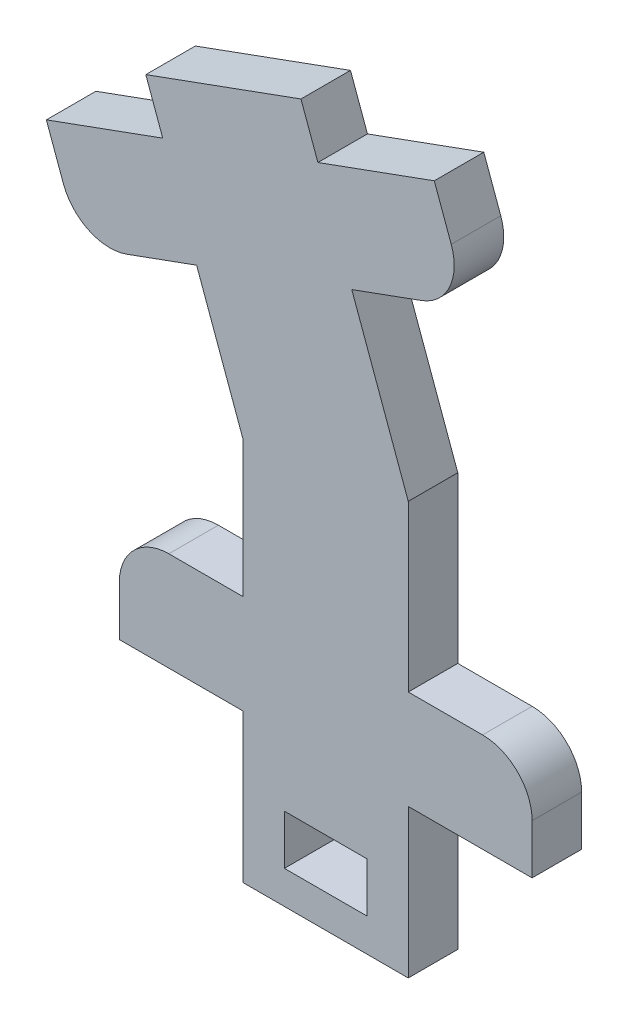
ISO-10303-21;
HEADER;
FILE_DESCRIPTION(('STEP AP214'),'2;1');
FILE_NAME('part.step','',(''),(''),'','','');
FILE_SCHEMA(('AUTOMOTIVE_DESIGN { 1 0 10303 214 1 1 1 1 }'));
ENDSEC;
DATA;
#1=APPLICATION_CONTEXT('core data for automotive mechanical design processes');
#2=APPLICATION_PROTOCOL_DEFINITION('international standard','automotive_design',2000,#1);
#3=PRODUCT_CONTEXT('',#1,'mechanical');
#4=PRODUCT('Part','Part','',(#3));
#5=PRODUCT_RELATED_PRODUCT_CATEGORY('part','',(#4));
#6=PRODUCT_DEFINITION_FORMATION('','',#4);
#7=PRODUCT_DEFINITION_CONTEXT('part definition',#1,'design');
#8=PRODUCT_DEFINITION('design','',#6,#7);
#9=PRODUCT_DEFINITION_SHAPE('','',#8);
#10=(LENGTH_UNIT() NAMED_UNIT(*) SI_UNIT(.MILLI.,.METRE.));
#11=(NAMED_UNIT(*) PLANE_ANGLE_UNIT() SI_UNIT($,.RADIAN.));
#12=(NAMED_UNIT(*) SI_UNIT($,.STERADIAN.) SOLID_ANGLE_UNIT());
#13=UNCERTAINTY_MEASURE_WITH_UNIT(LENGTH_MEASURE(1.E-05),#10,'distance_accuracy_value','');
#14=(GEOMETRIC_REPRESENTATION_CONTEXT(3) GLOBAL_UNCERTAINTY_ASSIGNED_CONTEXT((#13)) GLOBAL_UNIT_ASSIGNED_CONTEXT((#10,
#11,#12)) REPRESENTATION_CONTEXT('',''));
#15=CARTESIAN_POINT('',(0.,0.,0.));
#16=DIRECTION('',(0.,0.,1.));
#17=DIRECTION('',(1.,0.,0.));
#18=AXIS2_PLACEMENT_3D('',#15,#16,#17);
#19=CARTESIAN_POINT('',(14.5,-11.2367301929153,3.));
#20=DIRECTION('',(0.,0.,1.));
#21=DIRECTION('',(1.,0.,0.));
#22=AXIS2_PLACEMENT_3D('',#19,#20,#21);
#23=PLANE('',#22);
#24=DIRECTION('',(1.,0.,0.));
#25=VECTOR('',#24,1.);
#26=CARTESIAN_POINT('',(-7.49999999999999,-14.2367301929154,3.));
#27=LINE('',#26,#25);
#28=CARTESIAN_POINT('',(-7.49999999999999,-14.2367301929154,3.));
#29=VERTEX_POINT('',#28);
#30=CARTESIAN_POINT('',(0.,-14.2367301929154,3.));
#31=VERTEX_POINT('',#30);
#32=EDGE_CURVE('E285',#29,#31,#27,.T.);
#33=ORIENTED_EDGE('',*,*,#32,.T.);
#34=DIRECTION('',(0.,-1.,0.));
#35=VECTOR('',#34,1.);
#36=CARTESIAN_POINT('',(0.,-14.2367301929154,3.));
#37=LINE('',#36,#35);
#38=CARTESIAN_POINT('',(0.,-23.2367301929154,3.));
#39=VERTEX_POINT('',#38);
#40=EDGE_CURVE('E289',#31,#39,#37,.T.);
#41=ORIENTED_EDGE('',*,*,#40,.T.);
#42=DIRECTION('',(1.,0.,0.));
#43=VECTOR('',#42,1.);
#44=CARTESIAN_POINT('',(0.,-23.2367301929154,3.));
#45=LINE('',#44,#43);
#46=CARTESIAN_POINT('',(10.,-23.2367301929154,3.));
#47=VERTEX_POINT('',#46);
#48=EDGE_CURVE('E293',#39,#47,#45,.T.);
#49=ORIENTED_EDGE('',*,*,#48,.T.);
#50=DIRECTION('',(0.,1.,0.));
#51=VECTOR('',#50,1.);
#52=CARTESIAN_POINT('',(10.,-23.2367301929154,3.));
#53=LINE('',#52,#51);
#54=CARTESIAN_POINT('',(9.99999999999998,-14.2367301929154,3.));
#55=VERTEX_POINT('',#54);
#56=EDGE_CURVE('E296',#47,#55,#53,.T.);
#57=ORIENTED_EDGE('',*,*,#56,.T.);
#58=DIRECTION('',(1.,0.,0.));
#59=VECTOR('',#58,1.);
#60=CARTESIAN_POINT('',(9.99999999999998,-14.2367301929154,3.));
#61=LINE('',#60,#59);
#62=CARTESIAN_POINT('',(17.5,-14.2367301929154,3.));
#63=VERTEX_POINT('',#62);
#64=EDGE_CURVE('E299',#55,#63,#61,.T.);
#65=ORIENTED_EDGE('',*,*,#64,.T.);
#66=DIRECTION('',(0.,1.,0.));
#67=VECTOR('',#66,1.);
#68=CARTESIAN_POINT('',(17.5,-11.2367301929153,3.));
#69=LINE('',#68,#67);
#70=CARTESIAN_POINT('',(17.5,-11.2367301929153,3.));
#71=VERTEX_POINT('',#70);
#72=EDGE_CURVE('E302',#63,#71,#69,.T.);
#73=ORIENTED_EDGE('',*,*,#72,.T.);
#74=CARTESIAN_POINT('',(14.5,-11.2367301929153,3.));
#75=DIRECTION('',(0.,0.,1.));
#76=DIRECTION('',(1.,0.,0.));
#77=AXIS2_PLACEMENT_3D('',#74,#75,#76);
#78=CIRCLE('',#77,3.);
#79=CARTESIAN_POINT('',(14.5,-8.23673019291535,3.));
#80=VERTEX_POINT('',#79);
#81=EDGE_CURVE('E305',#71,#80,#78,.T.);
#82=ORIENTED_EDGE('',*,*,#81,.T.);
#83=DIRECTION('',(-1.,0.,0.));
#84=VECTOR('',#83,1.);
#85=CARTESIAN_POINT('',(10.,-8.23673019291535,3.));
#86=LINE('',#85,#84);
#87=CARTESIAN_POINT('',(10.,-8.23673019291535,3.));
#88=VERTEX_POINT('',#87);
#89=EDGE_CURVE('E308',#80,#88,#86,.T.);
#90=ORIENTED_EDGE('',*,*,#89,.T.);
#91=DIRECTION('',(0.,1.,0.));
#92=VECTOR('',#91,1.);
#93=CARTESIAN_POINT('',(10.,1.76326980708465,3.));
#94=LINE('',#93,#92);
#95=CARTESIAN_POINT('',(10.,1.76326980708465,3.));
#96=VERTEX_POINT('',#95);
#97=EDGE_CURVE('E311',#88,#96,#94,.T.);
#98=ORIENTED_EDGE('',*,*,#97,.T.);
#99=DIRECTION('',(-0.34202014332567,0.939692620785908,0.));
#100=VECTOR('',#99,1.);
#101=CARTESIAN_POINT('',(10.,1.76326980708465,3.));
#102=LINE('',#101,#100);
#103=CARTESIAN_POINT('',(6.5797985667433,11.1601960149437,3.));
#104=VERTEX_POINT('',#103);
#105=EDGE_CURVE('E314',#96,#104,#102,.T.);
#106=ORIENTED_EDGE('',*,*,#105,.T.);
#107=DIRECTION('',(0.939692620785908,0.342020143325671,0.));
#108=VECTOR('',#107,1.);
#109=CARTESIAN_POINT('',(6.5797985667433,11.1601960149437,3.));
#110=LINE('',#109,#108);
#111=CARTESIAN_POINT('',(10.8084153602799,12.6992866599092,3.));
#112=VERTEX_POINT('',#111);
#113=EDGE_CURVE('E317',#104,#112,#110,.T.);
#114=ORIENTED_EDGE('',*,*,#113,.T.);
#115=CARTESIAN_POINT('',(9.78235493030287,15.518364522267,3.));
#116=DIRECTION('',(0.,0.,1.));
#117=DIRECTION('',(-1.,0.,0.));
#118=AXIS2_PLACEMENT_3D('',#115,#116,#117);
#119=CIRCLE('',#118,3.);
#120=CARTESIAN_POINT('',(12.6014327926606,16.544424952244,3.));
#121=VERTEX_POINT('',#120);
#122=EDGE_CURVE('E320',#112,#121,#119,.T.);
#123=ORIENTED_EDGE('',*,*,#122,.T.);
#124=DIRECTION('',(-0.342020143325671,0.939692620785908,0.));
#125=VECTOR('',#124,1.);
#126=CARTESIAN_POINT('',(12.6014327926606,16.544424952244,3.));
#127=LINE('',#126,#125);
#128=CARTESIAN_POINT('',(11.5753723626836,19.3635028146017,3.));
#129=VERTEX_POINT('',#128);
#130=EDGE_CURVE('E323',#121,#129,#127,.T.);
#131=ORIENTED_EDGE('',*,*,#130,.T.);
#132=DIRECTION('',(-0.939692620785907,-0.342020143325672,0.));
#133=VECTOR('',#132,1.);
#134=CARTESIAN_POINT('',(11.5753723626836,19.3635028146017,3.));
#135=LINE('',#134,#133);
#136=CARTESIAN_POINT('',(4.52767770678928,16.7983517396592,3.));
#137=VERTEX_POINT('',#136);
#138=EDGE_CURVE('E326',#129,#137,#135,.T.);
#139=ORIENTED_EDGE('',*,*,#138,.T.);
#140=DIRECTION('',(-0.342020143325671,0.939692620785908,0.));
#141=VECTOR('',#140,1.);
#142=CARTESIAN_POINT('',(4.52767770678928,16.7983517396592,3.));
#143=LINE('',#142,#141);
#144=CARTESIAN_POINT('',(3.50161727681226,19.6174296020169,3.));
#145=VERTEX_POINT('',#144);
#146=EDGE_CURVE('E329',#137,#145,#143,.T.);
#147=ORIENTED_EDGE('',*,*,#146,.T.);
#148=DIRECTION('',(-0.939692620785908,-0.342020143325671,0.));
#149=VECTOR('',#148,1.);
#150=CARTESIAN_POINT('',(3.50161727681226,19.6174296020169,3.));
#151=LINE('',#150,#149);
#152=CARTESIAN_POINT('',(-5.89530893104681,16.1972281687602,3.));
#153=VERTEX_POINT('',#152);
#154=EDGE_CURVE('E332',#145,#153,#151,.T.);
#155=ORIENTED_EDGE('',*,*,#154,.T.);
#156=DIRECTION('',(0.342020143325671,-0.939692620785908,0.));
#157=VECTOR('',#156,1.);
#158=CARTESIAN_POINT('',(-5.89530893104681,16.1972281687602,3.));
#159=LINE('',#158,#157);
#160=CARTESIAN_POINT('',(-4.8692485010698,13.3781503064025,3.));
#161=VERTEX_POINT('',#160);
#162=EDGE_CURVE('E335',#153,#161,#159,.T.);
#163=ORIENTED_EDGE('',*,*,#162,.T.);
#164=DIRECTION('',(-0.939692620785908,-0.34202014332567,0.));
#165=VECTOR('',#164,1.);
#166=CARTESIAN_POINT('',(-4.8692485010698,13.3781503064025,3.));
#167=LINE('',#166,#165);
#168=CARTESIAN_POINT('',(-11.9169431569641,10.8129992314599,3.));
#169=VERTEX_POINT('',#168);
#170=EDGE_CURVE('E338',#161,#169,#167,.T.);
#171=ORIENTED_EDGE('',*,*,#170,.T.);
#172=DIRECTION('',(0.342020143325671,-0.939692620785908,0.));
#173=VECTOR('',#172,1.);
#174=CARTESIAN_POINT('',(-11.9169431569641,10.8129992314599,3.));
#175=LINE('',#174,#173);
#176=CARTESIAN_POINT('',(-10.8908827269871,7.99392136910221,3.));
#177=VERTEX_POINT('',#176);
#178=EDGE_CURVE('E341',#169,#177,#175,.T.);
#179=ORIENTED_EDGE('',*,*,#178,.T.);
#180=CARTESIAN_POINT('',(-8.07180486462937,9.01998179907923,3.));
#181=DIRECTION('',(0.,0.,1.));
#182=DIRECTION('',(1.,0.,0.));
#183=AXIS2_PLACEMENT_3D('',#180,#181,#182);
#184=CIRCLE('',#183,3.);
#185=CARTESIAN_POINT('',(-7.04574443465234,6.20090393672151,3.));
#186=VERTEX_POINT('',#185);
#187=EDGE_CURVE('E344',#177,#186,#184,.T.);
#188=ORIENTED_EDGE('',*,*,#187,.T.);
#189=DIRECTION('',(0.939692620785908,0.342020143325671,0.));
#190=VECTOR('',#189,1.);
#191=CARTESIAN_POINT('',(-7.04574443465234,6.20090393672151,3.));
#192=LINE('',#191,#190);
#193=CARTESIAN_POINT('',(-2.81712764111578,7.73999458168703,3.));
#194=VERTEX_POINT('',#193);
#195=EDGE_CURVE('E347',#186,#194,#192,.T.);
#196=ORIENTED_EDGE('',*,*,#195,.T.);
#197=DIRECTION('',(0.34202014332567,-0.939692620785908,0.));
#198=VECTOR('',#197,1.);
#199=CARTESIAN_POINT('',(-2.81712764111578,7.73999458168703,3.));
#200=LINE('',#199,#198);
#201=CARTESIAN_POINT('',(0.,0.,3.));
#202=VERTEX_POINT('',#201);
#203=EDGE_CURVE('E350',#194,#202,#200,.T.);
#204=ORIENTED_EDGE('',*,*,#203,.T.);
#205=DIRECTION('',(0.,-1.,0.));
#206=VECTOR('',#205,1.);
#207=CARTESIAN_POINT('',(0.,0.,3.));
#208=LINE('',#207,#206);
#209=CARTESIAN_POINT('',(0.,-8.23673019291535,3.));
#210=VERTEX_POINT('',#209);
#211=EDGE_CURVE('E353',#202,#210,#208,.T.);
#212=ORIENTED_EDGE('',*,*,#211,.T.);
#213=DIRECTION('',(-1.,0.,0.));
#214=VECTOR('',#213,1.);
#215=CARTESIAN_POINT('',(0.,-8.23673019291535,3.));
#216=LINE('',#215,#214);
#217=CARTESIAN_POINT('',(-4.49999999999999,-8.23673019291535,3.));
#218=VERTEX_POINT('',#217);
#219=EDGE_CURVE('E356',#210,#218,#216,.T.);
#220=ORIENTED_EDGE('',*,*,#219,.T.);
#221=CARTESIAN_POINT('',(-4.49999999999999,-11.2367301929153,3.));
#222=DIRECTION('',(0.,0.,1.));
#223=DIRECTION('',(-1.,0.,0.));
#224=AXIS2_PLACEMENT_3D('',#221,#222,#223);
#225=CIRCLE('',#224,3.);
#226=CARTESIAN_POINT('',(-7.49999999999999,-11.2367301929153,3.));
#227=VERTEX_POINT('',#226);
#228=EDGE_CURVE('E359',#218,#227,#225,.T.);
#229=ORIENTED_EDGE('',*,*,#228,.T.);
#230=DIRECTION('',(0.,-1.,0.));
#231=VECTOR('',#230,1.);
#232=CARTESIAN_POINT('',(-7.49999999999999,-11.2367301929153,3.));
#233=LINE('',#232,#231);
#234=EDGE_CURVE('E362',#227,#29,#233,.T.);
#235=ORIENTED_EDGE('',*,*,#234,.T.);
#236=EDGE_LOOP('',(#33,#41,#49,#57,#65,#73,#82,#90,#98,#106,#114,#123,#131,#139,#147,#155,#163,
#171,#179,#188,#196,#204,#212,#220,#229,#235));
#237=FACE_BOUND('',#236,.T.);
#238=DIRECTION('',(-1.,0.,0.));
#239=VECTOR('',#238,1.);
#240=CARTESIAN_POINT('',(2.5,-18.2367301929154,3.));
#241=LINE('',#240,#239);
#242=CARTESIAN_POINT('',(7.5,-18.2367301929154,3.));
#243=VERTEX_POINT('',#242);
#244=CARTESIAN_POINT('',(2.5,-18.2367301929154,3.));
#245=VERTEX_POINT('',#244);
#246=EDGE_CURVE('E246',#243,#245,#241,.T.);
#247=ORIENTED_EDGE('',*,*,#246,.F.);
#248=DIRECTION('',(0.,1.,0.));
#249=VECTOR('',#248,1.);
#250=CARTESIAN_POINT('',(7.5,-18.2367301929154,3.));
#251=LINE('',#250,#249);
#252=CARTESIAN_POINT('',(7.5,-21.2367301929154,3.));
#253=VERTEX_POINT('',#252);
#254=EDGE_CURVE('E237',#253,#243,#251,.T.);
#255=ORIENTED_EDGE('',*,*,#254,.F.);
#256=DIRECTION('',(1.,0.,0.));
#257=VECTOR('',#256,1.);
#258=CARTESIAN_POINT('',(2.5,-21.2367301929154,3.));
#259=LINE('',#258,#257);
#260=CARTESIAN_POINT('',(2.5,-21.2367301929154,3.));
#261=VERTEX_POINT('',#260);
#262=EDGE_CURVE('E263',#261,#253,#259,.T.);
#263=ORIENTED_EDGE('',*,*,#262,.F.);
#264=DIRECTION('',(0.,-1.,0.));
#265=VECTOR('',#264,1.);
#266=CARTESIAN_POINT('',(2.5,-18.2367301929154,3.));
#267=LINE('',#266,#265);
#268=EDGE_CURVE('E259',#245,#261,#267,.T.);
#269=ORIENTED_EDGE('',*,*,#268,.F.);
#270=EDGE_LOOP('',(#247,#255,#263,#269));
#271=FACE_BOUND('',#270,.T.);
#272=ADVANCED_FACE('F39',(#237,#271),#23,.T.);
#273=CARTESIAN_POINT('',(14.5,-11.2367301929153,0.));
#274=DIRECTION('',(0.,0.,1.));
#275=DIRECTION('',(1.,0.,0.));
#276=AXIS2_PLACEMENT_3D('',#273,#274,#275);
#277=PLANE('',#276);
#278=DIRECTION('',(1.,0.,0.));
#279=VECTOR('',#278,1.);
#280=CARTESIAN_POINT('',(-7.49999999999999,-14.2367301929154,0.));
#281=LINE('',#280,#279);
#282=CARTESIAN_POINT('',(-7.49999999999999,-14.2367301929154,0.));
#283=VERTEX_POINT('',#282);
#284=CARTESIAN_POINT('',(0.,-14.2367301929154,0.));
#285=VERTEX_POINT('',#284);
#286=EDGE_CURVE('E255',#283,#285,#281,.T.);
#287=ORIENTED_EDGE('',*,*,#286,.F.);
#288=DIRECTION('',(0.,-1.,0.));
#289=VECTOR('',#288,1.);
#290=CARTESIAN_POINT('',(-7.49999999999999,-11.2367301929153,0.));
#291=LINE('',#290,#289);
#292=CARTESIAN_POINT('',(-7.49999999999999,-11.2367301929153,0.));
#293=VERTEX_POINT('',#292);
#294=EDGE_CURVE('E290',#293,#283,#291,.T.);
#295=ORIENTED_EDGE('',*,*,#294,.F.);
#296=CARTESIAN_POINT('',(-4.49999999999999,-11.2367301929153,0.));
#297=DIRECTION('',(0.,0.,1.));
#298=DIRECTION('',(-1.,0.,0.));
#299=AXIS2_PLACEMENT_3D('',#296,#297,#298);
#300=CIRCLE('',#299,3.);
#301=CARTESIAN_POINT('',(-4.49999999999999,-8.23673019291535,0.));
#302=VERTEX_POINT('',#301);
#303=EDGE_CURVE('E438',#302,#293,#300,.T.);
#304=ORIENTED_EDGE('',*,*,#303,.F.);
#305=DIRECTION('',(-1.,0.,0.));
#306=VECTOR('',#305,1.);
#307=CARTESIAN_POINT('',(0.,-8.23673019291535,0.));
#308=LINE('',#307,#306);
#309=CARTESIAN_POINT('',(0.,-8.23673019291535,0.));
#310=VERTEX_POINT('',#309);
#311=EDGE_CURVE('E435',#310,#302,#308,.T.);
#312=ORIENTED_EDGE('',*,*,#311,.F.);
#313=DIRECTION('',(0.,-1.,0.));
#314=VECTOR('',#313,1.);
#315=CARTESIAN_POINT('',(0.,0.,0.));
#316=LINE('',#315,#314);
#317=CARTESIAN_POINT('',(0.,0.,0.));
#318=VERTEX_POINT('',#317);
#319=EDGE_CURVE('E432',#318,#310,#316,.T.);
#320=ORIENTED_EDGE('',*,*,#319,.F.);
#321=DIRECTION('',(0.34202014332567,-0.939692620785908,0.));
#322=VECTOR('',#321,1.);
#323=CARTESIAN_POINT('',(-2.81712764111578,7.73999458168703,0.));
#324=LINE('',#323,#322);
#325=CARTESIAN_POINT('',(-2.81712764111578,7.73999458168703,0.));
#326=VERTEX_POINT('',#325);
#327=EDGE_CURVE('E429',#326,#318,#324,.T.);
#328=ORIENTED_EDGE('',*,*,#327,.F.);
#329=DIRECTION('',(0.939692620785908,0.342020143325671,0.));
#330=VECTOR('',#329,1.);
#331=CARTESIAN_POINT('',(-7.04574443465234,6.20090393672151,0.));
#332=LINE('',#331,#330);
#333=CARTESIAN_POINT('',(-7.04574443465234,6.20090393672151,0.));
#334=VERTEX_POINT('',#333);
#335=EDGE_CURVE('E426',#334,#326,#332,.T.);
#336=ORIENTED_EDGE('',*,*,#335,.F.);
#337=CARTESIAN_POINT('',(-8.07180486462937,9.01998179907923,0.));
#338=DIRECTION('',(0.,0.,1.));
#339=DIRECTION('',(1.,0.,0.));
#340=AXIS2_PLACEMENT_3D('',#337,#338,#339);
#341=CIRCLE('',#340,3.);
#342=CARTESIAN_POINT('',(-10.8908827269871,7.99392136910221,0.));
#343=VERTEX_POINT('',#342);
#344=EDGE_CURVE('E423',#343,#334,#341,.T.);
#345=ORIENTED_EDGE('',*,*,#344,.F.);
#346=DIRECTION('',(0.342020143325671,-0.939692620785908,0.));
#347=VECTOR('',#346,1.);
#348=CARTESIAN_POINT('',(-11.9169431569641,10.8129992314599,0.));
#349=LINE('',#348,#347);
#350=CARTESIAN_POINT('',(-11.9169431569641,10.8129992314599,0.));
#351=VERTEX_POINT('',#350);
#352=EDGE_CURVE('E420',#351,#343,#349,.T.);
#353=ORIENTED_EDGE('',*,*,#352,.F.);
#354=DIRECTION('',(-0.939692620785908,-0.34202014332567,0.));
#355=VECTOR('',#354,1.);
#356=CARTESIAN_POINT('',(-4.8692485010698,13.3781503064025,0.));
#357=LINE('',#356,#355);
#358=CARTESIAN_POINT('',(-4.8692485010698,13.3781503064025,0.));
#359=VERTEX_POINT('',#358);
#360=EDGE_CURVE('E417',#359,#351,#357,.T.);
#361=ORIENTED_EDGE('',*,*,#360,.F.);
#362=DIRECTION('',(0.342020143325671,-0.939692620785908,0.));
#363=VECTOR('',#362,1.);
#364=CARTESIAN_POINT('',(-5.89530893104681,16.1972281687602,0.));
#365=LINE('',#364,#363);
#366=CARTESIAN_POINT('',(-5.89530893104681,16.1972281687602,0.));
#367=VERTEX_POINT('',#366);
#368=EDGE_CURVE('E414',#367,#359,#365,.T.);
#369=ORIENTED_EDGE('',*,*,#368,.F.);
#370=DIRECTION('',(-0.939692620785908,-0.342020143325671,0.));
#371=VECTOR('',#370,1.);
#372=CARTESIAN_POINT('',(3.50161727681226,19.6174296020169,0.));
#373=LINE('',#372,#371);
#374=CARTESIAN_POINT('',(3.50161727681226,19.6174296020169,0.));
#375=VERTEX_POINT('',#374);
#376=EDGE_CURVE('E411',#375,#367,#373,.T.);
#377=ORIENTED_EDGE('',*,*,#376,.F.);
#378=DIRECTION('',(-0.342020143325671,0.939692620785908,0.));
#379=VECTOR('',#378,1.);
#380=CARTESIAN_POINT('',(4.52767770678928,16.7983517396592,0.));
#381=LINE('',#380,#379);
#382=CARTESIAN_POINT('',(4.52767770678928,16.7983517396592,0.));
#383=VERTEX_POINT('',#382);
#384=EDGE_CURVE('E408',#383,#375,#381,.T.);
#385=ORIENTED_EDGE('',*,*,#384,.F.);
#386=DIRECTION('',(-0.939692620785907,-0.342020143325672,0.));
#387=VECTOR('',#386,1.);
#388=CARTESIAN_POINT('',(11.5753723626836,19.3635028146017,0.));
#389=LINE('',#388,#387);
#390=CARTESIAN_POINT('',(11.5753723626836,19.3635028146017,0.));
#391=VERTEX_POINT('',#390);
#392=EDGE_CURVE('E405',#391,#383,#389,.T.);
#393=ORIENTED_EDGE('',*,*,#392,.F.);
#394=DIRECTION('',(-0.342020143325671,0.939692620785908,0.));
#395=VECTOR('',#394,1.);
#396=CARTESIAN_POINT('',(12.6014327926606,16.544424952244,0.));
#397=LINE('',#396,#395);
#398=CARTESIAN_POINT('',(12.6014327926606,16.544424952244,0.));
#399=VERTEX_POINT('',#398);
#400=EDGE_CURVE('E402',#399,#391,#397,.T.);
#401=ORIENTED_EDGE('',*,*,#400,.F.);
#402=CARTESIAN_POINT('',(9.78235493030287,15.518364522267,0.));
#403=DIRECTION('',(0.,0.,1.));
#404=DIRECTION('',(-1.,0.,0.));
#405=AXIS2_PLACEMENT_3D('',#402,#403,#404);
#406=CIRCLE('',#405,3.);
#407=CARTESIAN_POINT('',(10.8084153602799,12.6992866599092,0.));
#408=VERTEX_POINT('',#407);
#409=EDGE_CURVE('E399',#408,#399,#406,.T.);
#410=ORIENTED_EDGE('',*,*,#409,.F.);
#411=DIRECTION('',(0.939692620785908,0.342020143325671,0.));
#412=VECTOR('',#411,1.);
#413=CARTESIAN_POINT('',(6.5797985667433,11.1601960149437,0.));
#414=LINE('',#413,#412);
#415=CARTESIAN_POINT('',(6.5797985667433,11.1601960149437,0.));
#416=VERTEX_POINT('',#415);
#417=EDGE_CURVE('E396',#416,#408,#414,.T.);
#418=ORIENTED_EDGE('',*,*,#417,.F.);
#419=DIRECTION('',(-0.34202014332567,0.939692620785908,0.));
#420=VECTOR('',#419,1.);
#421=CARTESIAN_POINT('',(10.,1.76326980708465,0.));
#422=LINE('',#421,#420);
#423=CARTESIAN_POINT('',(10.,1.76326980708465,0.));
#424=VERTEX_POINT('',#423);
#425=EDGE_CURVE('E393',#424,#416,#422,.T.);
#426=ORIENTED_EDGE('',*,*,#425,.F.);
#427=DIRECTION('',(0.,1.,0.));
#428=VECTOR('',#427,1.);
#429=CARTESIAN_POINT('',(10.,1.76326980708465,0.));
#430=LINE('',#429,#428);
#431=CARTESIAN_POINT('',(10.,-8.23673019291535,0.));
#432=VERTEX_POINT('',#431);
#433=EDGE_CURVE('E390',#432,#424,#430,.T.);
#434=ORIENTED_EDGE('',*,*,#433,.F.);
#435=DIRECTION('',(-1.,0.,0.));
#436=VECTOR('',#435,1.);
#437=CARTESIAN_POINT('',(10.,-8.23673019291535,0.));
#438=LINE('',#437,#436);
#439=CARTESIAN_POINT('',(14.5,-8.23673019291535,0.));
#440=VERTEX_POINT('',#439);
#441=EDGE_CURVE('E387',#440,#432,#438,.T.);
#442=ORIENTED_EDGE('',*,*,#441,.F.);
#443=CARTESIAN_POINT('',(14.5,-11.2367301929153,0.));
#444=DIRECTION('',(0.,0.,1.));
#445=DIRECTION('',(1.,0.,0.));
#446=AXIS2_PLACEMENT_3D('',#443,#444,#445);
#447=CIRCLE('',#446,3.);
#448=CARTESIAN_POINT('',(17.5,-11.2367301929153,0.));
#449=VERTEX_POINT('',#448);
#450=EDGE_CURVE('E384',#449,#440,#447,.T.);
#451=ORIENTED_EDGE('',*,*,#450,.F.);
#452=DIRECTION('',(0.,1.,0.));
#453=VECTOR('',#452,1.);
#454=CARTESIAN_POINT('',(17.5,-11.2367301929153,0.));
#455=LINE('',#454,#453);
#456=CARTESIAN_POINT('',(17.5,-14.2367301929154,0.));
#457=VERTEX_POINT('',#456);
#458=EDGE_CURVE('E381',#457,#449,#455,.T.);
#459=ORIENTED_EDGE('',*,*,#458,.F.);
#460=DIRECTION('',(1.,0.,0.));
#461=VECTOR('',#460,1.);
#462=CARTESIAN_POINT('',(9.99999999999998,-14.2367301929154,0.));
#463=LINE('',#462,#461);
#464=CARTESIAN_POINT('',(9.99999999999998,-14.2367301929154,0.));
#465=VERTEX_POINT('',#464);
#466=EDGE_CURVE('E378',#465,#457,#463,.T.);
#467=ORIENTED_EDGE('',*,*,#466,.F.);
#468=DIRECTION('',(0.,1.,0.));
#469=VECTOR('',#468,1.);
#470=CARTESIAN_POINT('',(10.,-23.2367301929154,0.));
#471=LINE('',#470,#469);
#472=CARTESIAN_POINT('',(10.,-23.2367301929154,0.));
#473=VERTEX_POINT('',#472);
#474=EDGE_CURVE('E375',#473,#465,#471,.T.);
#475=ORIENTED_EDGE('',*,*,#474,.F.);
#476=DIRECTION('',(1.,0.,0.));
#477=VECTOR('',#476,1.);
#478=CARTESIAN_POINT('',(0.,-23.2367301929154,0.));
#479=LINE('',#478,#477);
#480=CARTESIAN_POINT('',(0.,-23.2367301929154,0.));
#481=VERTEX_POINT('',#480);
#482=EDGE_CURVE('E372',#481,#473,#479,.T.);
#483=ORIENTED_EDGE('',*,*,#482,.F.);
#484=DIRECTION('',(0.,-1.,0.));
#485=VECTOR('',#484,1.);
#486=CARTESIAN_POINT('',(0.,-14.2367301929154,0.));
#487=LINE('',#486,#485);
#488=EDGE_CURVE('E369',#285,#481,#487,.T.);
#489=ORIENTED_EDGE('',*,*,#488,.F.);
#490=EDGE_LOOP('',(#287,#295,#304,#312,#320,#328,#336,#345,#353,#361,#369,#377,#385,#393,#401,
#410,#418,#426,#434,#442,#451,#459,#467,#475,#483,#489));
#491=FACE_BOUND('',#490,.T.);
#492=DIRECTION('',(0.,1.,0.));
#493=VECTOR('',#492,1.);
#494=CARTESIAN_POINT('',(7.5,-18.2367301929154,0.));
#495=LINE('',#494,#493);
#496=CARTESIAN_POINT('',(7.5,-21.2367301929154,0.));
#497=VERTEX_POINT('',#496);
#498=CARTESIAN_POINT('',(7.5,-18.2367301929154,0.));
#499=VERTEX_POINT('',#498);
#500=EDGE_CURVE('E63',#497,#499,#495,.T.);
#501=ORIENTED_EDGE('',*,*,#500,.T.);
#502=DIRECTION('',(-1.,0.,0.));
#503=VECTOR('',#502,1.);
#504=CARTESIAN_POINT('',(2.5,-18.2367301929154,0.));
#505=LINE('',#504,#503);
#506=CARTESIAN_POINT('',(2.5,-18.2367301929154,0.));
#507=VERTEX_POINT('',#506);
#508=EDGE_CURVE('E253',#499,#507,#505,.T.);
#509=ORIENTED_EDGE('',*,*,#508,.T.);
#510=DIRECTION('',(0.,-1.,0.));
#511=VECTOR('',#510,1.);
#512=CARTESIAN_POINT('',(2.5,-18.2367301929154,0.));
#513=LINE('',#512,#511);
#514=CARTESIAN_POINT('',(2.5,-21.2367301929154,0.));
#515=VERTEX_POINT('',#514);
#516=EDGE_CURVE('E272',#507,#515,#513,.T.);
#517=ORIENTED_EDGE('',*,*,#516,.T.);
#518=DIRECTION('',(1.,0.,0.));
#519=VECTOR('',#518,1.);
#520=CARTESIAN_POINT('',(2.5,-21.2367301929154,0.));
#521=LINE('',#520,#519);
#522=EDGE_CURVE('E247',#515,#497,#521,.T.);
#523=ORIENTED_EDGE('',*,*,#522,.T.);
#524=EDGE_LOOP('',(#501,#509,#517,#523));
#525=FACE_BOUND('',#524,.T.);
#526=ADVANCED_FACE('F549',(#491,#525),#277,.F.);
#527=CARTESIAN_POINT('',(-7.49999999999999,-14.2367301929154,3.));
#528=DIRECTION('',(0.,1.,0.));
#529=DIRECTION('',(0.,0.,1.));
#530=AXIS2_PLACEMENT_3D('',#527,#528,#529);
#531=PLANE('',#530);
#532=ORIENTED_EDGE('',*,*,#286,.T.);
#533=DIRECTION('',(0.,0.,-1.));
#534=VECTOR('',#533,1.);
#535=CARTESIAN_POINT('',(0.,-14.2367301929154,3.));
#536=LINE('',#535,#534);
#537=EDGE_CURVE('E11',#31,#285,#536,.T.);
#538=ORIENTED_EDGE('',*,*,#537,.F.);
#539=ORIENTED_EDGE('',*,*,#32,.F.);
#540=DIRECTION('',(0.,0.,-1.));
#541=VECTOR('',#540,1.);
#542=CARTESIAN_POINT('',(-7.49999999999999,-14.2367301929154,3.));
#543=LINE('',#542,#541);
#544=EDGE_CURVE('E365',#29,#283,#543,.T.);
#545=ORIENTED_EDGE('',*,*,#544,.T.);
#546=EDGE_LOOP('',(#532,#538,#539,#545));
#547=FACE_BOUND('',#546,.T.);
#548=ADVANCED_FACE('F41',(#547),#531,.F.);
#549=CARTESIAN_POINT('',(0.,-14.2367301929154,3.));
#550=DIRECTION('',(1.,0.,0.));
#551=DIRECTION('',(0.,1.,0.));
#552=AXIS2_PLACEMENT_3D('',#549,#550,#551);
#553=PLANE('',#552);
#554=ORIENTED_EDGE('',*,*,#488,.T.);
#555=DIRECTION('',(0.,0.,-1.));
#556=VECTOR('',#555,1.);
#557=CARTESIAN_POINT('',(0.,-23.2367301929154,3.));
#558=LINE('',#557,#556);
#559=EDGE_CURVE('E48',#39,#481,#558,.T.);
#560=ORIENTED_EDGE('',*,*,#559,.F.);
#561=ORIENTED_EDGE('',*,*,#40,.F.);
#562=ORIENTED_EDGE('',*,*,#537,.T.);
#563=EDGE_LOOP('',(#554,#560,#561,#562));
#564=FACE_BOUND('',#563,.T.);
#565=ADVANCED_FACE('F566',(#564),#553,.F.);
#566=CARTESIAN_POINT('',(0.,-23.2367301929154,3.));
#567=DIRECTION('',(0.,1.,0.));
#568=DIRECTION('',(0.,0.,1.));
#569=AXIS2_PLACEMENT_3D('',#566,#567,#568);
#570=PLANE('',#569);
#571=ORIENTED_EDGE('',*,*,#482,.T.);
#572=DIRECTION('',(0.,0.,-1.));
#573=VECTOR('',#572,1.);
#574=CARTESIAN_POINT('',(10.,-23.2367301929154,3.));
#575=LINE('',#574,#573);
#576=EDGE_CURVE('E534',#47,#473,#575,.T.);
#577=ORIENTED_EDGE('',*,*,#576,.F.);
#578=ORIENTED_EDGE('',*,*,#48,.F.);
#579=ORIENTED_EDGE('',*,*,#559,.T.);
#580=EDGE_LOOP('',(#571,#577,#578,#579));
#581=FACE_BOUND('',#580,.T.);
#582=ADVANCED_FACE('F543',(#581),#570,.F.);
#583=CARTESIAN_POINT('',(10.,-23.2367301929154,3.));
#584=DIRECTION('',(-1.,0.,0.));
#585=DIRECTION('',(0.,-1.,0.));
#586=AXIS2_PLACEMENT_3D('',#583,#584,#585);
#587=PLANE('',#586);
#588=ORIENTED_EDGE('',*,*,#474,.T.);
#589=DIRECTION('',(0.,0.,-1.));
#590=VECTOR('',#589,1.);
#591=CARTESIAN_POINT('',(9.99999999999998,-14.2367301929154,3.));
#592=LINE('',#591,#590);
#593=EDGE_CURVE('E530',#55,#465,#592,.T.);
#594=ORIENTED_EDGE('',*,*,#593,.F.);
#595=ORIENTED_EDGE('',*,*,#56,.F.);
#596=ORIENTED_EDGE('',*,*,#576,.T.);
#597=EDGE_LOOP('',(#588,#594,#595,#596));
#598=FACE_BOUND('',#597,.T.);
#599=ADVANCED_FACE('F555',(#598),#587,.F.);
#600=CARTESIAN_POINT('',(9.99999999999998,-14.2367301929154,3.));
#601=DIRECTION('',(0.,1.,0.));
#602=DIRECTION('',(0.,0.,1.));
#603=AXIS2_PLACEMENT_3D('',#600,#601,#602);
#604=PLANE('',#603);
#605=ORIENTED_EDGE('',*,*,#466,.T.);
#606=DIRECTION('',(0.,0.,-1.));
#607=VECTOR('',#606,1.);
#608=CARTESIAN_POINT('',(17.5,-14.2367301929154,3.));
#609=LINE('',#608,#607);
#610=EDGE_CURVE('E526',#63,#457,#609,.T.);
#611=ORIENTED_EDGE('',*,*,#610,.F.);
#612=ORIENTED_EDGE('',*,*,#64,.F.);
#613=ORIENTED_EDGE('',*,*,#593,.T.);
#614=EDGE_LOOP('',(#605,#611,#612,#613));
#615=FACE_BOUND('',#614,.T.);
#616=ADVANCED_FACE('F559',(#615),#604,.F.);
#617=CARTESIAN_POINT('',(17.5,-11.2367301929153,3.));
#618=DIRECTION('',(-1.,0.,0.));
#619=DIRECTION('',(0.,0.,1.));
#620=AXIS2_PLACEMENT_3D('',#617,#618,#619);
#621=PLANE('',#620);
#622=ORIENTED_EDGE('',*,*,#458,.T.);
#623=DIRECTION('',(0.,0.,-1.));
#624=VECTOR('',#623,1.);
#625=CARTESIAN_POINT('',(17.5,-11.2367301929153,3.));
#626=LINE('',#625,#624);
#627=EDGE_CURVE('E522',#71,#449,#626,.T.);
#628=ORIENTED_EDGE('',*,*,#627,.F.);
#629=ORIENTED_EDGE('',*,*,#72,.F.);
#630=ORIENTED_EDGE('',*,*,#610,.T.);
#631=EDGE_LOOP('',(#622,#628,#629,#630));
#632=FACE_BOUND('',#631,.T.);
#633=ADVANCED_FACE('F669',(#632),#621,.F.);
#634=CARTESIAN_POINT('',(14.5,-11.2367301929153,3.));
#635=DIRECTION('',(0.,0.,-1.));
#636=DIRECTION('',(-1.,0.,0.));
#637=AXIS2_PLACEMENT_3D('',#634,#635,#636);
#638=CYLINDRICAL_SURFACE('',#637,3.);
#639=ORIENTED_EDGE('',*,*,#450,.T.);
#640=DIRECTION('',(0.,0.,-1.));
#641=VECTOR('',#640,1.);
#642=CARTESIAN_POINT('',(14.5,-8.23673019291535,3.));
#643=LINE('',#642,#641);
#644=EDGE_CURVE('E518',#80,#440,#643,.T.);
#645=ORIENTED_EDGE('',*,*,#644,.F.);
#646=ORIENTED_EDGE('',*,*,#81,.F.);
#647=ORIENTED_EDGE('',*,*,#627,.T.);
#648=EDGE_LOOP('',(#639,#645,#646,#647));
#649=FACE_BOUND('',#648,.T.);
#650=ADVANCED_FACE('F667',(#649),#638,.T.);
#651=CARTESIAN_POINT('',(10.,-8.23673019291535,3.));
#652=DIRECTION('',(0.,-1.,0.));
#653=DIRECTION('',(1.,0.,0.));
#654=AXIS2_PLACEMENT_3D('',#651,#652,#653);
#655=PLANE('',#654);
#656=ORIENTED_EDGE('',*,*,#441,.T.);
#657=DIRECTION('',(0.,0.,-1.));
#658=VECTOR('',#657,1.);
#659=CARTESIAN_POINT('',(10.,-8.23673019291535,3.));
#660=LINE('',#659,#658);
#661=EDGE_CURVE('E514',#88,#432,#660,.T.);
#662=ORIENTED_EDGE('',*,*,#661,.F.);
#663=ORIENTED_EDGE('',*,*,#89,.F.);
#664=ORIENTED_EDGE('',*,*,#644,.T.);
#665=EDGE_LOOP('',(#656,#662,#663,#664));
#666=FACE_BOUND('',#665,.T.);
#667=ADVANCED_FACE('F662',(#666),#655,.F.);
#668=CARTESIAN_POINT('',(10.,1.76326980708465,3.));
#669=DIRECTION('',(-1.,0.,0.));
#670=DIRECTION('',(0.,-1.,0.));
#671=AXIS2_PLACEMENT_3D('',#668,#669,#670);
#672=PLANE('',#671);
#673=ORIENTED_EDGE('',*,*,#433,.T.);
#674=DIRECTION('',(0.,0.,-1.));
#675=VECTOR('',#674,1.);
#676=CARTESIAN_POINT('',(10.,1.76326980708465,3.));
#677=LINE('',#676,#675);
#678=EDGE_CURVE('E510',#96,#424,#677,.T.);
#679=ORIENTED_EDGE('',*,*,#678,.F.);
#680=ORIENTED_EDGE('',*,*,#97,.F.);
#681=ORIENTED_EDGE('',*,*,#661,.T.);
#682=EDGE_LOOP('',(#673,#679,#680,#681));
#683=FACE_BOUND('',#682,.T.);
#684=ADVANCED_FACE('F657',(#683),#672,.F.);
#685=CARTESIAN_POINT('',(10.,1.76326980708465,3.));
#686=DIRECTION('',(-0.939692620785908,-0.34202014332567,0.));
#687=DIRECTION('',(0.34202014332567,-0.939692620785908,0.));
#688=AXIS2_PLACEMENT_3D('',#685,#686,#687);
#689=PLANE('',#688);
#690=ORIENTED_EDGE('',*,*,#425,.T.);
#691=DIRECTION('',(0.,0.,-1.));
#692=VECTOR('',#691,1.);
#693=CARTESIAN_POINT('',(6.5797985667433,11.1601960149437,3.));
#694=LINE('',#693,#692);
#695=EDGE_CURVE('E506',#104,#416,#694,.T.);
#696=ORIENTED_EDGE('',*,*,#695,.F.);
#697=ORIENTED_EDGE('',*,*,#105,.F.);
#698=ORIENTED_EDGE('',*,*,#678,.T.);
#699=EDGE_LOOP('',(#690,#696,#697,#698));
#700=FACE_BOUND('',#699,.T.);
#701=ADVANCED_FACE('F653',(#700),#689,.F.);
#702=CARTESIAN_POINT('',(6.5797985667433,11.1601960149437,3.));
#703=DIRECTION('',(-0.342020143325671,0.939692620785908,0.));
#704=DIRECTION('',(-0.939692620785908,-0.342020143325671,0.));
#705=AXIS2_PLACEMENT_3D('',#702,#703,#704);
#706=PLANE('',#705);
#707=ORIENTED_EDGE('',*,*,#417,.T.);
#708=DIRECTION('',(0.,0.,-1.));
#709=VECTOR('',#708,1.);
#710=CARTESIAN_POINT('',(10.8084153602799,12.6992866599092,3.));
#711=LINE('',#710,#709);
#712=EDGE_CURVE('E502',#112,#408,#711,.T.);
#713=ORIENTED_EDGE('',*,*,#712,.F.);
#714=ORIENTED_EDGE('',*,*,#113,.F.);
#715=ORIENTED_EDGE('',*,*,#695,.T.);
#716=EDGE_LOOP('',(#707,#713,#714,#715));
#717=FACE_BOUND('',#716,.T.);
#718=ADVANCED_FACE('F648',(#717),#706,.F.);
#719=CARTESIAN_POINT('',(9.78235493030287,15.518364522267,3.));
#720=DIRECTION('',(0.,0.,-1.));
#721=DIRECTION('',(-1.,0.,0.));
#722=AXIS2_PLACEMENT_3D('',#719,#720,#721);
#723=CYLINDRICAL_SURFACE('',#722,3.);
#724=ORIENTED_EDGE('',*,*,#409,.T.);
#725=DIRECTION('',(0.,0.,-1.));
#726=VECTOR('',#725,1.);
#727=CARTESIAN_POINT('',(12.6014327926606,16.544424952244,3.));
#728=LINE('',#727,#726);
#729=EDGE_CURVE('E498',#121,#399,#728,.T.);
#730=ORIENTED_EDGE('',*,*,#729,.F.);
#731=ORIENTED_EDGE('',*,*,#122,.F.);
#732=ORIENTED_EDGE('',*,*,#712,.T.);
#733=EDGE_LOOP('',(#724,#730,#731,#732));
#734=FACE_BOUND('',#733,.T.);
#735=ADVANCED_FACE('F642',(#734),#723,.T.);
#736=CARTESIAN_POINT('',(12.6014327926606,16.544424952244,3.));
#737=DIRECTION('',(-0.939692620785908,-0.342020143325671,0.));
#738=DIRECTION('',(0.342020143325671,-0.939692620785908,0.));
#739=AXIS2_PLACEMENT_3D('',#736,#737,#738);
#740=PLANE('',#739);
#741=ORIENTED_EDGE('',*,*,#400,.T.);
#742=DIRECTION('',(0.,0.,-1.));
#743=VECTOR('',#742,1.);
#744=CARTESIAN_POINT('',(11.5753723626836,19.3635028146017,3.));
#745=LINE('',#744,#743);
#746=EDGE_CURVE('E494',#129,#391,#745,.T.);
#747=ORIENTED_EDGE('',*,*,#746,.F.);
#748=ORIENTED_EDGE('',*,*,#130,.F.);
#749=ORIENTED_EDGE('',*,*,#729,.T.);
#750=EDGE_LOOP('',(#741,#747,#748,#749));
#751=FACE_BOUND('',#750,.T.);
#752=ADVANCED_FACE('F638',(#751),#740,.F.);
#753=CARTESIAN_POINT('',(11.5753723626836,19.3635028146017,3.));
#754=DIRECTION('',(0.342020143325672,-0.939692620785907,0.));
#755=DIRECTION('',(0.939692620785907,0.342020143325672,0.));
#756=AXIS2_PLACEMENT_3D('',#753,#754,#755);
#757=PLANE('',#756);
#758=ORIENTED_EDGE('',*,*,#392,.T.);
#759=DIRECTION('',(0.,0.,-1.));
#760=VECTOR('',#759,1.);
#761=CARTESIAN_POINT('',(4.52767770678928,16.7983517396592,3.));
#762=LINE('',#761,#760);
#763=EDGE_CURVE('E490',#137,#383,#762,.T.);
#764=ORIENTED_EDGE('',*,*,#763,.F.);
#765=ORIENTED_EDGE('',*,*,#138,.F.);
#766=ORIENTED_EDGE('',*,*,#746,.T.);
#767=EDGE_LOOP('',(#758,#764,#765,#766));
#768=FACE_BOUND('',#767,.T.);
#769=ADVANCED_FACE('F633',(#768),#757,.F.);
#770=CARTESIAN_POINT('',(4.52767770678928,16.7983517396592,3.));
#771=DIRECTION('',(-0.939692620785908,-0.342020143325671,0.));
#772=DIRECTION('',(0.342020143325671,-0.939692620785908,0.));
#773=AXIS2_PLACEMENT_3D('',#770,#771,#772);
#774=PLANE('',#773);
#775=ORIENTED_EDGE('',*,*,#384,.T.);
#776=DIRECTION('',(0.,0.,-1.));
#777=VECTOR('',#776,1.);
#778=CARTESIAN_POINT('',(3.50161727681226,19.6174296020169,3.));
#779=LINE('',#778,#777);
#780=EDGE_CURVE('E486',#145,#375,#779,.T.);
#781=ORIENTED_EDGE('',*,*,#780,.F.);
#782=ORIENTED_EDGE('',*,*,#146,.F.);
#783=ORIENTED_EDGE('',*,*,#763,.T.);
#784=EDGE_LOOP('',(#775,#781,#782,#783));
#785=FACE_BOUND('',#784,.T.);
#786=ADVANCED_FACE('F627',(#785),#774,.F.);
#787=CARTESIAN_POINT('',(3.50161727681226,19.6174296020169,3.));
#788=DIRECTION('',(0.342020143325671,-0.939692620785908,0.));
#789=DIRECTION('',(0.939692620785908,0.342020143325671,0.));
#790=AXIS2_PLACEMENT_3D('',#787,#788,#789);
#791=PLANE('',#790);
#792=ORIENTED_EDGE('',*,*,#376,.T.);
#793=DIRECTION('',(0.,0.,-1.));
#794=VECTOR('',#793,1.);
#795=CARTESIAN_POINT('',(-5.89530893104681,16.1972281687602,3.));
#796=LINE('',#795,#794);
#797=EDGE_CURVE('E482',#153,#367,#796,.T.);
#798=ORIENTED_EDGE('',*,*,#797,.F.);
#799=ORIENTED_EDGE('',*,*,#154,.F.);
#800=ORIENTED_EDGE('',*,*,#780,.T.);
#801=EDGE_LOOP('',(#792,#798,#799,#800));
#802=FACE_BOUND('',#801,.T.);
#803=ADVANCED_FACE('F623',(#802),#791,.F.);
#804=CARTESIAN_POINT('',(-5.89530893104681,16.1972281687602,3.));
#805=DIRECTION('',(0.939692620785908,0.342020143325671,0.));
#806=DIRECTION('',(-0.342020143325671,0.939692620785908,0.));
#807=AXIS2_PLACEMENT_3D('',#804,#805,#806);
#808=PLANE('',#807);
#809=ORIENTED_EDGE('',*,*,#368,.T.);
#810=DIRECTION('',(0.,0.,-1.));
#811=VECTOR('',#810,1.);
#812=CARTESIAN_POINT('',(-4.8692485010698,13.3781503064025,3.));
#813=LINE('',#812,#811);
#814=EDGE_CURVE('E478',#161,#359,#813,.T.);
#815=ORIENTED_EDGE('',*,*,#814,.F.);
#816=ORIENTED_EDGE('',*,*,#162,.F.);
#817=ORIENTED_EDGE('',*,*,#797,.T.);
#818=EDGE_LOOP('',(#809,#815,#816,#817));
#819=FACE_BOUND('',#818,.T.);
#820=ADVANCED_FACE('F618',(#819),#808,.F.);
#821=CARTESIAN_POINT('',(-4.8692485010698,13.3781503064025,3.));
#822=DIRECTION('',(0.34202014332567,-0.939692620785908,0.));
#823=DIRECTION('',(0.939692620785908,0.34202014332567,0.));
#824=AXIS2_PLACEMENT_3D('',#821,#822,#823);
#825=PLANE('',#824);
#826=ORIENTED_EDGE('',*,*,#360,.T.);
#827=DIRECTION('',(0.,0.,-1.));
#828=VECTOR('',#827,1.);
#829=CARTESIAN_POINT('',(-11.9169431569641,10.8129992314599,3.));
#830=LINE('',#829,#828);
#831=EDGE_CURVE('E474',#169,#351,#830,.T.);
#832=ORIENTED_EDGE('',*,*,#831,.F.);
#833=ORIENTED_EDGE('',*,*,#170,.F.);
#834=ORIENTED_EDGE('',*,*,#814,.T.);
#835=EDGE_LOOP('',(#826,#832,#833,#834));
#836=FACE_BOUND('',#835,.T.);
#837=ADVANCED_FACE('F612',(#836),#825,.F.);
#838=CARTESIAN_POINT('',(-11.9169431569641,10.8129992314599,3.));
#839=DIRECTION('',(0.939692620785908,0.342020143325671,0.));
#840=DIRECTION('',(-0.342020143325671,0.939692620785908,0.));
#841=AXIS2_PLACEMENT_3D('',#838,#839,#840);
#842=PLANE('',#841);
#843=ORIENTED_EDGE('',*,*,#352,.T.);
#844=DIRECTION('',(0.,0.,-1.));
#845=VECTOR('',#844,1.);
#846=CARTESIAN_POINT('',(-10.8908827269871,7.99392136910221,3.));
#847=LINE('',#846,#845);
#848=EDGE_CURVE('E470',#177,#343,#847,.T.);
#849=ORIENTED_EDGE('',*,*,#848,.F.);
#850=ORIENTED_EDGE('',*,*,#178,.F.);
#851=ORIENTED_EDGE('',*,*,#831,.T.);
#852=EDGE_LOOP('',(#843,#849,#850,#851));
#853=FACE_BOUND('',#852,.T.);
#854=ADVANCED_FACE('F608',(#853),#842,.F.);
#855=CARTESIAN_POINT('',(-8.07180486462937,9.01998179907923,3.));
#856=DIRECTION('',(0.,0.,-1.));
#857=DIRECTION('',(-1.,0.,0.));
#858=AXIS2_PLACEMENT_3D('',#855,#856,#857);
#859=CYLINDRICAL_SURFACE('',#858,3.);
#860=ORIENTED_EDGE('',*,*,#344,.T.);
#861=DIRECTION('',(0.,0.,-1.));
#862=VECTOR('',#861,1.);
#863=CARTESIAN_POINT('',(-7.04574443465234,6.20090393672151,3.));
#864=LINE('',#863,#862);
#865=EDGE_CURVE('E466',#186,#334,#864,.T.);
#866=ORIENTED_EDGE('',*,*,#865,.F.);
#867=ORIENTED_EDGE('',*,*,#187,.F.);
#868=ORIENTED_EDGE('',*,*,#848,.T.);
#869=EDGE_LOOP('',(#860,#866,#867,#868));
#870=FACE_BOUND('',#869,.T.);
#871=ADVANCED_FACE('F603',(#870),#859,.T.);
#872=CARTESIAN_POINT('',(-7.04574443465234,6.20090393672151,3.));
#873=DIRECTION('',(-0.342020143325671,0.939692620785908,0.));
#874=DIRECTION('',(-0.939692620785908,-0.342020143325671,0.));
#875=AXIS2_PLACEMENT_3D('',#872,#873,#874);
#876=PLANE('',#875);
#877=ORIENTED_EDGE('',*,*,#335,.T.);
#878=DIRECTION('',(0.,0.,-1.));
#879=VECTOR('',#878,1.);
#880=CARTESIAN_POINT('',(-2.81712764111578,7.73999458168703,3.));
#881=LINE('',#880,#879);
#882=EDGE_CURVE('E462',#194,#326,#881,.T.);
#883=ORIENTED_EDGE('',*,*,#882,.F.);
#884=ORIENTED_EDGE('',*,*,#195,.F.);
#885=ORIENTED_EDGE('',*,*,#865,.T.);
#886=EDGE_LOOP('',(#877,#883,#884,#885));
#887=FACE_BOUND('',#886,.T.);
#888=ADVANCED_FACE('F597',(#887),#876,.F.);
#889=CARTESIAN_POINT('',(-2.81712764111578,7.73999458168703,3.));
#890=DIRECTION('',(0.939692620785908,0.34202014332567,0.));
#891=DIRECTION('',(-0.34202014332567,0.939692620785908,0.));
#892=AXIS2_PLACEMENT_3D('',#889,#890,#891);
#893=PLANE('',#892);
#894=ORIENTED_EDGE('',*,*,#327,.T.);
#895=DIRECTION('',(0.,0.,-1.));
#896=VECTOR('',#895,1.);
#897=CARTESIAN_POINT('',(0.,0.,3.));
#898=LINE('',#897,#896);
#899=EDGE_CURVE('E458',#202,#318,#898,.T.);
#900=ORIENTED_EDGE('',*,*,#899,.F.);
#901=ORIENTED_EDGE('',*,*,#203,.F.);
#902=ORIENTED_EDGE('',*,*,#882,.T.);
#903=EDGE_LOOP('',(#894,#900,#901,#902));
#904=FACE_BOUND('',#903,.T.);
#905=ADVANCED_FACE('F593',(#904),#893,.F.);
#906=CARTESIAN_POINT('',(0.,0.,3.));
#907=DIRECTION('',(1.,0.,0.));
#908=DIRECTION('',(0.,1.,0.));
#909=AXIS2_PLACEMENT_3D('',#906,#907,#908);
#910=PLANE('',#909);
#911=ORIENTED_EDGE('',*,*,#319,.T.);
#912=DIRECTION('',(0.,0.,-1.));
#913=VECTOR('',#912,1.);
#914=CARTESIAN_POINT('',(0.,-8.23673019291535,3.));
#915=LINE('',#914,#913);
#916=EDGE_CURVE('E454',#210,#310,#915,.T.);
#917=ORIENTED_EDGE('',*,*,#916,.F.);
#918=ORIENTED_EDGE('',*,*,#211,.F.);
#919=ORIENTED_EDGE('',*,*,#899,.T.);
#920=EDGE_LOOP('',(#911,#917,#918,#919));
#921=FACE_BOUND('',#920,.T.);
#922=ADVANCED_FACE('F588',(#921),#910,.F.);
#923=CARTESIAN_POINT('',(0.,-8.23673019291535,3.));
#924=DIRECTION('',(0.,-1.,0.));
#925=DIRECTION('',(1.,0.,0.));
#926=AXIS2_PLACEMENT_3D('',#923,#924,#925);
#927=PLANE('',#926);
#928=ORIENTED_EDGE('',*,*,#311,.T.);
#929=DIRECTION('',(0.,0.,-1.));
#930=VECTOR('',#929,1.);
#931=CARTESIAN_POINT('',(-4.49999999999999,-8.23673019291535,3.));
#932=LINE('',#931,#930);
#933=EDGE_CURVE('E450',#218,#302,#932,.T.);
#934=ORIENTED_EDGE('',*,*,#933,.F.);
#935=ORIENTED_EDGE('',*,*,#219,.F.);
#936=ORIENTED_EDGE('',*,*,#916,.T.);
#937=EDGE_LOOP('',(#928,#934,#935,#936));
#938=FACE_BOUND('',#937,.T.);
#939=ADVANCED_FACE('F582',(#938),#927,.F.);
#940=CARTESIAN_POINT('',(-4.49999999999999,-11.2367301929153,3.));
#941=DIRECTION('',(0.,0.,-1.));
#942=DIRECTION('',(-1.,0.,0.));
#943=AXIS2_PLACEMENT_3D('',#940,#941,#942);
#944=CYLINDRICAL_SURFACE('',#943,3.);
#945=ORIENTED_EDGE('',*,*,#303,.T.);
#946=DIRECTION('',(0.,0.,-1.));
#947=VECTOR('',#946,1.);
#948=CARTESIAN_POINT('',(-7.49999999999999,-11.2367301929153,3.));
#949=LINE('',#948,#947);
#950=EDGE_CURVE('E446',#227,#293,#949,.T.);
#951=ORIENTED_EDGE('',*,*,#950,.F.);
#952=ORIENTED_EDGE('',*,*,#228,.F.);
#953=ORIENTED_EDGE('',*,*,#933,.T.);
#954=EDGE_LOOP('',(#945,#951,#952,#953));
#955=FACE_BOUND('',#954,.T.);
#956=ADVANCED_FACE('F578',(#955),#944,.T.);
#957=CARTESIAN_POINT('',(-7.49999999999999,-11.2367301929153,3.));
#958=DIRECTION('',(1.,0.,0.));
#959=DIRECTION('',(0.,1.,0.));
#960=AXIS2_PLACEMENT_3D('',#957,#958,#959);
#961=PLANE('',#960);
#962=ORIENTED_EDGE('',*,*,#294,.T.);
#963=ORIENTED_EDGE('',*,*,#544,.F.);
#964=ORIENTED_EDGE('',*,*,#234,.F.);
#965=ORIENTED_EDGE('',*,*,#950,.T.);
#966=EDGE_LOOP('',(#962,#963,#964,#965));
#967=FACE_BOUND('',#966,.T.);
#968=ADVANCED_FACE('F573',(#967),#961,.F.);
#969=CARTESIAN_POINT('',(7.5,-18.2367301929154,3.));
#970=DIRECTION('',(-1.,0.,0.));
#971=DIRECTION('',(0.,-1.,0.));
#972=AXIS2_PLACEMENT_3D('',#969,#970,#971);
#973=PLANE('',#972);
#974=ORIENTED_EDGE('',*,*,#500,.F.);
#975=DIRECTION('',(0.,0.,-1.));
#976=VECTOR('',#975,1.);
#977=CARTESIAN_POINT('',(7.5,-21.2367301929154,3.));
#978=LINE('',#977,#976);
#979=EDGE_CURVE('E241',#253,#497,#978,.T.);
#980=ORIENTED_EDGE('',*,*,#979,.F.);
#981=ORIENTED_EDGE('',*,*,#254,.T.);
#982=DIRECTION('',(0.,0.,-1.));
#983=VECTOR('',#982,1.);
#984=CARTESIAN_POINT('',(7.5,-18.2367301929154,3.));
#985=LINE('',#984,#983);
#986=EDGE_CURVE('E240',#243,#499,#985,.T.);
#987=ORIENTED_EDGE('',*,*,#986,.T.);
#988=EDGE_LOOP('',(#974,#980,#981,#987));
#989=FACE_BOUND('',#988,.T.);
#990=ADVANCED_FACE('F239',(#989),#973,.T.);
#991=CARTESIAN_POINT('',(2.5,-18.2367301929154,3.));
#992=DIRECTION('',(0.,-1.,0.));
#993=DIRECTION('',(0.,0.,-1.));
#994=AXIS2_PLACEMENT_3D('',#991,#992,#993);
#995=PLANE('',#994);
#996=ORIENTED_EDGE('',*,*,#508,.F.);
#997=ORIENTED_EDGE('',*,*,#986,.F.);
#998=ORIENTED_EDGE('',*,*,#246,.T.);
#999=DIRECTION('',(0.,0.,-1.));
#1000=VECTOR('',#999,1.);
#1001=CARTESIAN_POINT('',(2.5,-18.2367301929154,3.));
#1002=LINE('',#1001,#1000);
#1003=EDGE_CURVE('E256',#245,#507,#1002,.T.);
#1004=ORIENTED_EDGE('',*,*,#1003,.T.);
#1005=EDGE_LOOP('',(#996,#997,#998,#1004));
#1006=FACE_BOUND('',#1005,.T.);
#1007=ADVANCED_FACE('F250',(#1006),#995,.T.);
#1008=CARTESIAN_POINT('',(2.5,-18.2367301929154,3.));
#1009=DIRECTION('',(1.,0.,0.));
#1010=DIRECTION('',(0.,0.,-1.));
#1011=AXIS2_PLACEMENT_3D('',#1008,#1009,#1010);
#1012=PLANE('',#1011);
#1013=ORIENTED_EDGE('',*,*,#516,.F.);
#1014=ORIENTED_EDGE('',*,*,#1003,.F.);
#1015=ORIENTED_EDGE('',*,*,#268,.T.);
#1016=DIRECTION('',(0.,0.,-1.));
#1017=VECTOR('',#1016,1.);
#1018=CARTESIAN_POINT('',(2.5,-21.2367301929154,3.));
#1019=LINE('',#1018,#1017);
#1020=EDGE_CURVE('E55',#261,#515,#1019,.T.);
#1021=ORIENTED_EDGE('',*,*,#1020,.T.);
#1022=EDGE_LOOP('',(#1013,#1014,#1015,#1021));
#1023=FACE_BOUND('',#1022,.T.);
#1024=ADVANCED_FACE('F811',(#1023),#1012,.T.);
#1025=CARTESIAN_POINT('',(2.5,-21.2367301929154,3.));
#1026=DIRECTION('',(0.,1.,0.));
#1027=DIRECTION('',(0.,0.,1.));
#1028=AXIS2_PLACEMENT_3D('',#1025,#1026,#1027);
#1029=PLANE('',#1028);
#1030=ORIENTED_EDGE('',*,*,#522,.F.);
#1031=ORIENTED_EDGE('',*,*,#1020,.F.);
#1032=ORIENTED_EDGE('',*,*,#262,.T.);
#1033=ORIENTED_EDGE('',*,*,#979,.T.);
#1034=EDGE_LOOP('',(#1030,#1031,#1032,#1033));
#1035=FACE_BOUND('',#1034,.T.);
#1036=ADVANCED_FACE('F817',(#1035),#1029,.T.);
#1037=CLOSED_SHELL('',(#272,#526,#548,#565,#582,#599,#616,#633,#650,#667,#684,#701,#718,#735,
#752,#769,#786,#803,#820,#837,#854,#871,#888,#905,#922,#939,#956,#968,#990,#1007,#1024,#1036));
#1038=MANIFOLD_SOLID_BREP('B2',#1037);
#1039=ADVANCED_BREP_SHAPE_REPRESENTATION('',(#18,#1038),#14);
#1040=SHAPE_DEFINITION_REPRESENTATION(#9,#1039);
ENDSEC;
END-ISO-10303-21;
